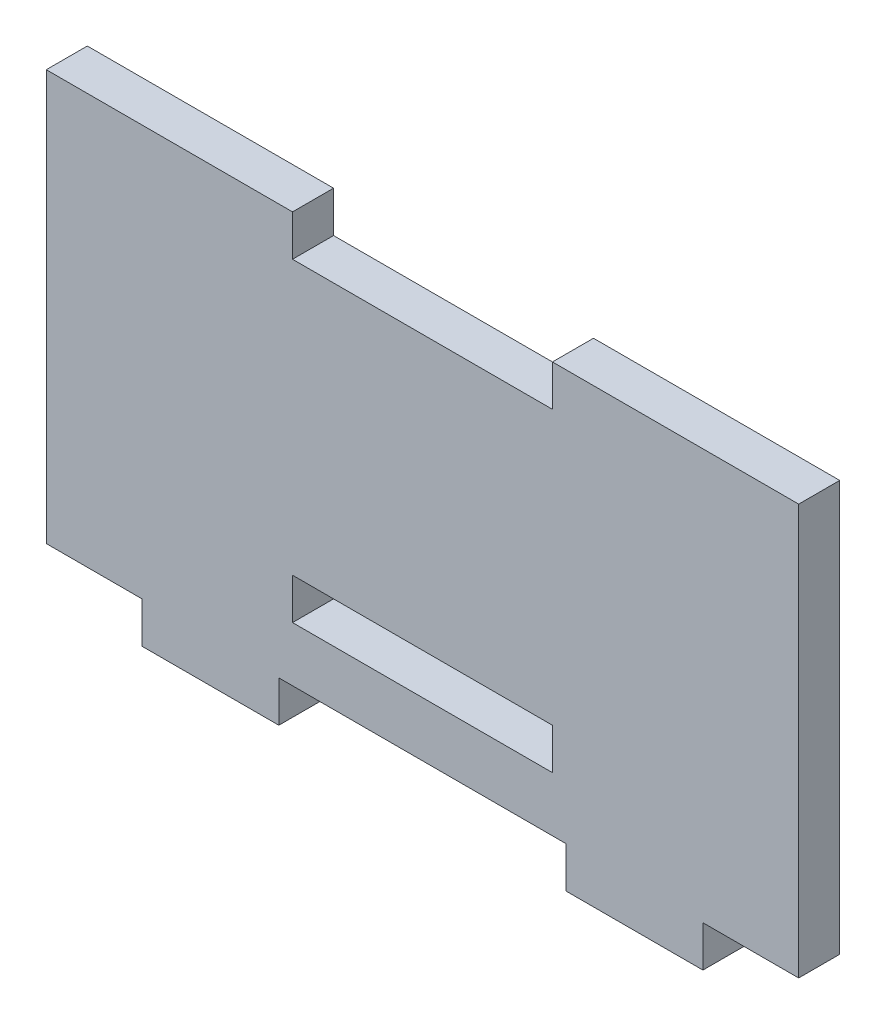
ISO-10303-21;
HEADER;
FILE_DESCRIPTION(('STEP AP214'),'2;1');
FILE_NAME('part.step','',(''),(''),'','','');
FILE_SCHEMA(('AUTOMOTIVE_DESIGN { 1 0 10303 214 1 1 1 1 }'));
ENDSEC;
DATA;
#1=APPLICATION_CONTEXT('core data for automotive mechanical design processes');
#2=APPLICATION_PROTOCOL_DEFINITION('international standard','automotive_design',2000,#1);
#3=PRODUCT_CONTEXT('',#1,'mechanical');
#4=PRODUCT('Part','Part','',(#3));
#5=PRODUCT_RELATED_PRODUCT_CATEGORY('part','',(#4));
#6=PRODUCT_DEFINITION_FORMATION('','',#4);
#7=PRODUCT_DEFINITION_CONTEXT('part definition',#1,'design');
#8=PRODUCT_DEFINITION('design','',#6,#7);
#9=PRODUCT_DEFINITION_SHAPE('','',#8);
#10=(LENGTH_UNIT() NAMED_UNIT(*) SI_UNIT(.MILLI.,.METRE.));
#11=(NAMED_UNIT(*) PLANE_ANGLE_UNIT() SI_UNIT($,.RADIAN.));
#12=(NAMED_UNIT(*) SI_UNIT($,.STERADIAN.) SOLID_ANGLE_UNIT());
#13=UNCERTAINTY_MEASURE_WITH_UNIT(LENGTH_MEASURE(1.E-05),#10,'distance_accuracy_value','');
#14=(GEOMETRIC_REPRESENTATION_CONTEXT(3) GLOBAL_UNCERTAINTY_ASSIGNED_CONTEXT((#13)) GLOBAL_UNIT_ASSIGNED_CONTEXT((#10,
#11,#12)) REPRESENTATION_CONTEXT('',''));
#15=CARTESIAN_POINT('',(0.,0.,0.));
#16=DIRECTION('',(0.,0.,1.));
#17=DIRECTION('',(1.,0.,0.));
#18=AXIS2_PLACEMENT_3D('',#15,#16,#17);
#19=CARTESIAN_POINT('',(0.,0.,3.));
#20=DIRECTION('',(0.,1.,0.));
#21=DIRECTION('',(0.,0.,1.));
#22=AXIS2_PLACEMENT_3D('',#19,#20,#21);
#23=PLANE('',#22);
#24=DIRECTION('',(1.,0.,0.));
#25=VECTOR('',#24,1.);
#26=CARTESIAN_POINT('',(0.,0.,0.));
#27=LINE('',#26,#25);
#28=CARTESIAN_POINT('',(17.,0.,0.));
#29=VERTEX_POINT('',#28);
#30=CARTESIAN_POINT('',(38.,0.,0.));
#31=VERTEX_POINT('',#30);
#32=EDGE_CURVE('E217',#29,#31,#27,.T.);
#33=ORIENTED_EDGE('',*,*,#32,.T.);
#34=DIRECTION('',(0.,0.,-1.));
#35=VECTOR('',#34,1.);
#36=CARTESIAN_POINT('',(38.,0.,3.));
#37=LINE('',#36,#35);
#38=CARTESIAN_POINT('',(38.,0.,3.));
#39=VERTEX_POINT('',#38);
#40=EDGE_CURVE('E11',#39,#31,#37,.T.);
#41=ORIENTED_EDGE('',*,*,#40,.F.);
#42=DIRECTION('',(1.,0.,0.));
#43=VECTOR('',#42,1.);
#44=CARTESIAN_POINT('',(0.,0.,3.));
#45=LINE('',#44,#43);
#46=CARTESIAN_POINT('',(17.,0.,3.));
#47=VERTEX_POINT('',#46);
#48=EDGE_CURVE('E309',#47,#39,#45,.T.);
#49=ORIENTED_EDGE('',*,*,#48,.F.);
#50=DIRECTION('',(0.,0.,-1.));
#51=VECTOR('',#50,1.);
#52=CARTESIAN_POINT('',(17.,0.,3.));
#53=LINE('',#52,#51);
#54=EDGE_CURVE('E259',#47,#29,#53,.T.);
#55=ORIENTED_EDGE('',*,*,#54,.T.);
#56=EDGE_LOOP('',(#33,#41,#49,#55));
#57=FACE_BOUND('',#56,.T.);
#58=ADVANCED_FACE('F35',(#57),#23,.F.);
#59=CARTESIAN_POINT('',(38.,0.,3.));
#60=DIRECTION('',(-1.,0.,0.));
#61=DIRECTION('',(0.,0.,1.));
#62=AXIS2_PLACEMENT_3D('',#59,#60,#61);
#63=PLANE('',#62);
#64=DIRECTION('',(0.,1.,0.));
#65=VECTOR('',#64,1.);
#66=CARTESIAN_POINT('',(38.,0.,0.));
#67=LINE('',#66,#65);
#68=CARTESIAN_POINT('',(38.,-3.,0.));
#69=VERTEX_POINT('',#68);
#70=EDGE_CURVE('E220',#69,#31,#67,.T.);
#71=ORIENTED_EDGE('',*,*,#70,.F.);
#72=DIRECTION('',(0.,0.,-1.));
#73=VECTOR('',#72,1.);
#74=CARTESIAN_POINT('',(38.,-3.,3.));
#75=LINE('',#74,#73);
#76=CARTESIAN_POINT('',(38.,-3.,3.));
#77=VERTEX_POINT('',#76);
#78=EDGE_CURVE('E45',#77,#69,#75,.T.);
#79=ORIENTED_EDGE('',*,*,#78,.F.);
#80=DIRECTION('',(0.,1.,0.));
#81=VECTOR('',#80,1.);
#82=CARTESIAN_POINT('',(38.,0.,3.));
#83=LINE('',#82,#81);
#84=EDGE_CURVE('E312',#77,#39,#83,.T.);
#85=ORIENTED_EDGE('',*,*,#84,.T.);
#86=ORIENTED_EDGE('',*,*,#40,.T.);
#87=EDGE_LOOP('',(#71,#79,#85,#86));
#88=FACE_BOUND('',#87,.T.);
#89=ADVANCED_FACE('F371',(#88),#63,.T.);
#90=CARTESIAN_POINT('',(0.,-2.99999999999999,3.));
#91=DIRECTION('',(0.,-1.,0.));
#92=DIRECTION('',(1.,0.,0.));
#93=AXIS2_PLACEMENT_3D('',#90,#91,#92);
#94=PLANE('',#93);
#95=DIRECTION('',(-1.,0.,0.));
#96=VECTOR('',#95,1.);
#97=CARTESIAN_POINT('',(0.,-2.99999999999999,0.));
#98=LINE('',#97,#96);
#99=CARTESIAN_POINT('',(48.,-3.,0.));
#100=VERTEX_POINT('',#99);
#101=EDGE_CURVE('E223',#100,#69,#98,.T.);
#102=ORIENTED_EDGE('',*,*,#101,.F.);
#103=DIRECTION('',(0.,0.,-1.));
#104=VECTOR('',#103,1.);
#105=CARTESIAN_POINT('',(48.,-3.,3.));
#106=LINE('',#105,#104);
#107=CARTESIAN_POINT('',(48.,-3.,3.));
#108=VERTEX_POINT('',#107);
#109=EDGE_CURVE('E281',#108,#100,#106,.T.);
#110=ORIENTED_EDGE('',*,*,#109,.F.);
#111=DIRECTION('',(-1.,0.,0.));
#112=VECTOR('',#111,1.);
#113=CARTESIAN_POINT('',(0.,-2.99999999999999,3.));
#114=LINE('',#113,#112);
#115=EDGE_CURVE('E319',#108,#77,#114,.T.);
#116=ORIENTED_EDGE('',*,*,#115,.T.);
#117=ORIENTED_EDGE('',*,*,#78,.T.);
#118=EDGE_LOOP('',(#102,#110,#116,#117));
#119=FACE_BOUND('',#118,.T.);
#120=ADVANCED_FACE('F377',(#119),#94,.T.);
#121=CARTESIAN_POINT('',(48.,0.,3.));
#122=DIRECTION('',(1.,0.,0.));
#123=DIRECTION('',(0.,0.,-1.));
#124=AXIS2_PLACEMENT_3D('',#121,#122,#123);
#125=PLANE('',#124);
#126=DIRECTION('',(0.,-1.,0.));
#127=VECTOR('',#126,1.);
#128=CARTESIAN_POINT('',(48.,0.,0.));
#129=LINE('',#128,#127);
#130=CARTESIAN_POINT('',(48.,0.,0.));
#131=VERTEX_POINT('',#130);
#132=EDGE_CURVE('E226',#131,#100,#129,.T.);
#133=ORIENTED_EDGE('',*,*,#132,.F.);
#134=DIRECTION('',(0.,0.,-1.));
#135=VECTOR('',#134,1.);
#136=CARTESIAN_POINT('',(48.,0.,3.));
#137=LINE('',#136,#135);
#138=CARTESIAN_POINT('',(48.,0.,3.));
#139=VERTEX_POINT('',#138);
#140=EDGE_CURVE('E279',#139,#131,#137,.T.);
#141=ORIENTED_EDGE('',*,*,#140,.F.);
#142=DIRECTION('',(0.,-1.,0.));
#143=VECTOR('',#142,1.);
#144=CARTESIAN_POINT('',(48.,0.,3.));
#145=LINE('',#144,#143);
#146=EDGE_CURVE('E322',#139,#108,#145,.T.);
#147=ORIENTED_EDGE('',*,*,#146,.T.);
#148=ORIENTED_EDGE('',*,*,#109,.T.);
#149=EDGE_LOOP('',(#133,#141,#147,#148));
#150=FACE_BOUND('',#149,.T.);
#151=ADVANCED_FACE('F516',(#150),#125,.T.);
#152=CARTESIAN_POINT('',(0.,-1.42742960308949E-13,3.));
#153=DIRECTION('',(0.,-1.,0.));
#154=DIRECTION('',(1.,0.,0.));
#155=AXIS2_PLACEMENT_3D('',#152,#153,#154);
#156=PLANE('',#155);
#157=DIRECTION('',(-1.,0.,0.));
#158=VECTOR('',#157,1.);
#159=CARTESIAN_POINT('',(0.,-1.42742960308949E-13,0.));
#160=LINE('',#159,#158);
#161=CARTESIAN_POINT('',(55.,0.,0.));
#162=VERTEX_POINT('',#161);
#163=EDGE_CURVE('E229',#162,#131,#160,.T.);
#164=ORIENTED_EDGE('',*,*,#163,.F.);
#165=DIRECTION('',(0.,0.,-1.));
#166=VECTOR('',#165,1.);
#167=CARTESIAN_POINT('',(55.,0.,3.));
#168=LINE('',#167,#166);
#169=CARTESIAN_POINT('',(55.,0.,3.));
#170=VERTEX_POINT('',#169);
#171=EDGE_CURVE('E277',#170,#162,#168,.T.);
#172=ORIENTED_EDGE('',*,*,#171,.F.);
#173=DIRECTION('',(-1.,0.,0.));
#174=VECTOR('',#173,1.);
#175=CARTESIAN_POINT('',(0.,-1.42742960308949E-13,3.));
#176=LINE('',#175,#174);
#177=EDGE_CURVE('E325',#170,#139,#176,.T.);
#178=ORIENTED_EDGE('',*,*,#177,.T.);
#179=ORIENTED_EDGE('',*,*,#140,.T.);
#180=EDGE_LOOP('',(#164,#172,#178,#179));
#181=FACE_BOUND('',#180,.T.);
#182=ADVANCED_FACE('F507',(#181),#156,.T.);
#183=CARTESIAN_POINT('',(55.,0.,3.));
#184=DIRECTION('',(1.,0.,0.));
#185=DIRECTION('',(0.,1.,0.));
#186=AXIS2_PLACEMENT_3D('',#183,#184,#185);
#187=PLANE('',#186);
#188=DIRECTION('',(0.,-1.,0.));
#189=VECTOR('',#188,1.);
#190=CARTESIAN_POINT('',(55.,0.,0.));
#191=LINE('',#190,#189);
#192=CARTESIAN_POINT('',(55.,30.,0.));
#193=VERTEX_POINT('',#192);
#194=EDGE_CURVE('E232',#193,#162,#191,.T.);
#195=ORIENTED_EDGE('',*,*,#194,.F.);
#196=DIRECTION('',(0.,0.,-1.));
#197=VECTOR('',#196,1.);
#198=CARTESIAN_POINT('',(55.,30.,3.));
#199=LINE('',#198,#197);
#200=CARTESIAN_POINT('',(55.,30.,3.));
#201=VERTEX_POINT('',#200);
#202=EDGE_CURVE('E275',#201,#193,#199,.T.);
#203=ORIENTED_EDGE('',*,*,#202,.F.);
#204=DIRECTION('',(0.,-1.,0.));
#205=VECTOR('',#204,1.);
#206=CARTESIAN_POINT('',(55.,0.,3.));
#207=LINE('',#206,#205);
#208=EDGE_CURVE('E328',#201,#170,#207,.T.);
#209=ORIENTED_EDGE('',*,*,#208,.T.);
#210=ORIENTED_EDGE('',*,*,#171,.T.);
#211=EDGE_LOOP('',(#195,#203,#209,#210));
#212=FACE_BOUND('',#211,.T.);
#213=ADVANCED_FACE('F498',(#212),#187,.T.);
#214=CARTESIAN_POINT('',(0.,30.,3.));
#215=DIRECTION('',(0.,1.,0.));
#216=DIRECTION('',(-1.,0.,0.));
#217=AXIS2_PLACEMENT_3D('',#214,#215,#216);
#218=PLANE('',#217);
#219=DIRECTION('',(1.,0.,0.));
#220=VECTOR('',#219,1.);
#221=CARTESIAN_POINT('',(0.,30.,0.));
#222=LINE('',#221,#220);
#223=CARTESIAN_POINT('',(37.,30.,0.));
#224=VERTEX_POINT('',#223);
#225=EDGE_CURVE('E235',#224,#193,#222,.T.);
#226=ORIENTED_EDGE('',*,*,#225,.F.);
#227=DIRECTION('',(0.,0.,-1.));
#228=VECTOR('',#227,1.);
#229=CARTESIAN_POINT('',(37.,30.,3.));
#230=LINE('',#229,#228);
#231=CARTESIAN_POINT('',(37.,30.,3.));
#232=VERTEX_POINT('',#231);
#233=EDGE_CURVE('E273',#232,#224,#230,.T.);
#234=ORIENTED_EDGE('',*,*,#233,.F.);
#235=DIRECTION('',(1.,0.,0.));
#236=VECTOR('',#235,1.);
#237=CARTESIAN_POINT('',(0.,30.,3.));
#238=LINE('',#237,#236);
#239=EDGE_CURVE('E331',#232,#201,#238,.T.);
#240=ORIENTED_EDGE('',*,*,#239,.T.);
#241=ORIENTED_EDGE('',*,*,#202,.T.);
#242=EDGE_LOOP('',(#226,#234,#240,#241));
#243=FACE_BOUND('',#242,.T.);
#244=ADVANCED_FACE('F489',(#243),#218,.T.);
#245=CARTESIAN_POINT('',(37.0000000000001,0.,3.));
#246=DIRECTION('',(-1.,0.,0.));
#247=DIRECTION('',(0.,-1.,0.));
#248=AXIS2_PLACEMENT_3D('',#245,#246,#247);
#249=PLANE('',#248);
#250=DIRECTION('',(0.,1.,0.));
#251=VECTOR('',#250,1.);
#252=CARTESIAN_POINT('',(37.0000000000001,0.,0.));
#253=LINE('',#252,#251);
#254=CARTESIAN_POINT('',(37.,27.,0.));
#255=VERTEX_POINT('',#254);
#256=EDGE_CURVE('E238',#255,#224,#253,.T.);
#257=ORIENTED_EDGE('',*,*,#256,.F.);
#258=DIRECTION('',(0.,0.,-1.));
#259=VECTOR('',#258,1.);
#260=CARTESIAN_POINT('',(37.,27.,3.));
#261=LINE('',#260,#259);
#262=CARTESIAN_POINT('',(37.,27.,3.));
#263=VERTEX_POINT('',#262);
#264=EDGE_CURVE('E271',#263,#255,#261,.T.);
#265=ORIENTED_EDGE('',*,*,#264,.F.);
#266=DIRECTION('',(0.,1.,0.));
#267=VECTOR('',#266,1.);
#268=CARTESIAN_POINT('',(37.0000000000001,0.,3.));
#269=LINE('',#268,#267);
#270=EDGE_CURVE('E334',#263,#232,#269,.T.);
#271=ORIENTED_EDGE('',*,*,#270,.T.);
#272=ORIENTED_EDGE('',*,*,#233,.T.);
#273=EDGE_LOOP('',(#257,#265,#271,#272));
#274=FACE_BOUND('',#273,.T.);
#275=ADVANCED_FACE('F480',(#274),#249,.T.);
#276=CARTESIAN_POINT('',(0.,27.,3.));
#277=DIRECTION('',(0.,1.,0.));
#278=DIRECTION('',(-1.,0.,0.));
#279=AXIS2_PLACEMENT_3D('',#276,#277,#278);
#280=PLANE('',#279);
#281=DIRECTION('',(1.,0.,0.));
#282=VECTOR('',#281,1.);
#283=CARTESIAN_POINT('',(0.,27.,0.));
#284=LINE('',#283,#282);
#285=CARTESIAN_POINT('',(18.,27.,0.));
#286=VERTEX_POINT('',#285);
#287=EDGE_CURVE('E241',#286,#255,#284,.T.);
#288=ORIENTED_EDGE('',*,*,#287,.F.);
#289=DIRECTION('',(0.,0.,-1.));
#290=VECTOR('',#289,1.);
#291=CARTESIAN_POINT('',(18.,27.,3.));
#292=LINE('',#291,#290);
#293=CARTESIAN_POINT('',(18.,27.,3.));
#294=VERTEX_POINT('',#293);
#295=EDGE_CURVE('E269',#294,#286,#292,.T.);
#296=ORIENTED_EDGE('',*,*,#295,.F.);
#297=DIRECTION('',(1.,0.,0.));
#298=VECTOR('',#297,1.);
#299=CARTESIAN_POINT('',(0.,27.,3.));
#300=LINE('',#299,#298);
#301=EDGE_CURVE('E337',#294,#263,#300,.T.);
#302=ORIENTED_EDGE('',*,*,#301,.T.);
#303=ORIENTED_EDGE('',*,*,#264,.T.);
#304=EDGE_LOOP('',(#288,#296,#302,#303));
#305=FACE_BOUND('',#304,.T.);
#306=ADVANCED_FACE('F471',(#305),#280,.T.);
#307=CARTESIAN_POINT('',(18.,0.,3.));
#308=DIRECTION('',(1.,0.,0.));
#309=DIRECTION('',(0.,0.,-1.));
#310=AXIS2_PLACEMENT_3D('',#307,#308,#309);
#311=PLANE('',#310);
#312=DIRECTION('',(0.,-1.,0.));
#313=VECTOR('',#312,1.);
#314=CARTESIAN_POINT('',(18.,0.,0.));
#315=LINE('',#314,#313);
#316=CARTESIAN_POINT('',(18.,30.,0.));
#317=VERTEX_POINT('',#316);
#318=EDGE_CURVE('E244',#317,#286,#315,.T.);
#319=ORIENTED_EDGE('',*,*,#318,.F.);
#320=DIRECTION('',(0.,0.,-1.));
#321=VECTOR('',#320,1.);
#322=CARTESIAN_POINT('',(18.,30.,3.));
#323=LINE('',#322,#321);
#324=CARTESIAN_POINT('',(18.,30.,3.));
#325=VERTEX_POINT('',#324);
#326=EDGE_CURVE('E267',#325,#317,#323,.T.);
#327=ORIENTED_EDGE('',*,*,#326,.F.);
#328=DIRECTION('',(0.,-1.,0.));
#329=VECTOR('',#328,1.);
#330=CARTESIAN_POINT('',(18.,0.,3.));
#331=LINE('',#330,#329);
#332=EDGE_CURVE('E340',#325,#294,#331,.T.);
#333=ORIENTED_EDGE('',*,*,#332,.T.);
#334=ORIENTED_EDGE('',*,*,#295,.T.);
#335=EDGE_LOOP('',(#319,#327,#333,#334));
#336=FACE_BOUND('',#335,.T.);
#337=ADVANCED_FACE('F463',(#336),#311,.T.);
#338=CARTESIAN_POINT('',(0.,30.,3.));
#339=DIRECTION('',(0.,1.,0.));
#340=DIRECTION('',(-1.,0.,0.));
#341=AXIS2_PLACEMENT_3D('',#338,#339,#340);
#342=PLANE('',#341);
#343=DIRECTION('',(1.,0.,0.));
#344=VECTOR('',#343,1.);
#345=CARTESIAN_POINT('',(0.,30.,0.));
#346=LINE('',#345,#344);
#347=CARTESIAN_POINT('',(0.,30.,0.));
#348=VERTEX_POINT('',#347);
#349=EDGE_CURVE('E247',#348,#317,#346,.T.);
#350=ORIENTED_EDGE('',*,*,#349,.F.);
#351=DIRECTION('',(0.,0.,-1.));
#352=VECTOR('',#351,1.);
#353=CARTESIAN_POINT('',(0.,30.,3.));
#354=LINE('',#353,#352);
#355=CARTESIAN_POINT('',(0.,30.,3.));
#356=VERTEX_POINT('',#355);
#357=EDGE_CURVE('E265',#356,#348,#354,.T.);
#358=ORIENTED_EDGE('',*,*,#357,.F.);
#359=DIRECTION('',(1.,0.,0.));
#360=VECTOR('',#359,1.);
#361=CARTESIAN_POINT('',(0.,30.,3.));
#362=LINE('',#361,#360);
#363=EDGE_CURVE('E343',#356,#325,#362,.T.);
#364=ORIENTED_EDGE('',*,*,#363,.T.);
#365=ORIENTED_EDGE('',*,*,#326,.T.);
#366=EDGE_LOOP('',(#350,#358,#364,#365));
#367=FACE_BOUND('',#366,.T.);
#368=ADVANCED_FACE('F356',(#367),#342,.T.);
#369=CARTESIAN_POINT('',(0.,0.,3.));
#370=DIRECTION('',(-1.,0.,0.));
#371=DIRECTION('',(0.,0.,1.));
#372=AXIS2_PLACEMENT_3D('',#369,#370,#371);
#373=PLANE('',#372);
#374=DIRECTION('',(0.,1.,0.));
#375=VECTOR('',#374,1.);
#376=CARTESIAN_POINT('',(0.,0.,0.));
#377=LINE('',#376,#375);
#378=CARTESIAN_POINT('',(0.,0.,0.));
#379=VERTEX_POINT('',#378);
#380=EDGE_CURVE('E250',#379,#348,#377,.T.);
#381=ORIENTED_EDGE('',*,*,#380,.F.);
#382=DIRECTION('',(0.,0.,-1.));
#383=VECTOR('',#382,1.);
#384=CARTESIAN_POINT('',(0.,0.,3.));
#385=LINE('',#384,#383);
#386=CARTESIAN_POINT('',(0.,0.,3.));
#387=VERTEX_POINT('',#386);
#388=EDGE_CURVE('E263',#387,#379,#385,.T.);
#389=ORIENTED_EDGE('',*,*,#388,.F.);
#390=DIRECTION('',(0.,1.,0.));
#391=VECTOR('',#390,1.);
#392=CARTESIAN_POINT('',(0.,0.,3.));
#393=LINE('',#392,#391);
#394=EDGE_CURVE('E346',#387,#356,#393,.T.);
#395=ORIENTED_EDGE('',*,*,#394,.T.);
#396=ORIENTED_EDGE('',*,*,#357,.T.);
#397=EDGE_LOOP('',(#381,#389,#395,#396));
#398=FACE_BOUND('',#397,.T.);
#399=ADVANCED_FACE('F350',(#398),#373,.T.);
#400=CARTESIAN_POINT('',(0.,0.,3.));
#401=DIRECTION('',(0.,1.,0.));
#402=DIRECTION('',(0.,0.,1.));
#403=AXIS2_PLACEMENT_3D('',#400,#401,#402);
#404=PLANE('',#403);
#405=DIRECTION('',(1.,0.,0.));
#406=VECTOR('',#405,1.);
#407=CARTESIAN_POINT('',(0.,0.,0.));
#408=LINE('',#407,#406);
#409=CARTESIAN_POINT('',(7.,0.,0.));
#410=VERTEX_POINT('',#409);
#411=EDGE_CURVE('E253',#379,#410,#408,.T.);
#412=ORIENTED_EDGE('',*,*,#411,.T.);
#413=DIRECTION('',(0.,0.,-1.));
#414=VECTOR('',#413,1.);
#415=CARTESIAN_POINT('',(7.,0.,3.));
#416=LINE('',#415,#414);
#417=CARTESIAN_POINT('',(7.,0.,3.));
#418=VERTEX_POINT('',#417);
#419=EDGE_CURVE('E197',#418,#410,#416,.T.);
#420=ORIENTED_EDGE('',*,*,#419,.F.);
#421=DIRECTION('',(1.,0.,0.));
#422=VECTOR('',#421,1.);
#423=CARTESIAN_POINT('',(0.,0.,3.));
#424=LINE('',#423,#422);
#425=EDGE_CURVE('E188',#387,#418,#424,.T.);
#426=ORIENTED_EDGE('',*,*,#425,.F.);
#427=ORIENTED_EDGE('',*,*,#388,.T.);
#428=EDGE_LOOP('',(#412,#420,#426,#427));
#429=FACE_BOUND('',#428,.T.);
#430=ADVANCED_FACE('F361',(#429),#404,.F.);
#431=CARTESIAN_POINT('',(7.,0.,3.));
#432=DIRECTION('',(1.,0.,0.));
#433=DIRECTION('',(0.,0.,-1.));
#434=AXIS2_PLACEMENT_3D('',#431,#432,#433);
#435=PLANE('',#434);
#436=DIRECTION('',(0.,-1.,0.));
#437=VECTOR('',#436,1.);
#438=CARTESIAN_POINT('',(7.,0.,0.));
#439=LINE('',#438,#437);
#440=CARTESIAN_POINT('',(7.,-3.,0.));
#441=VERTEX_POINT('',#440);
#442=EDGE_CURVE('E196',#410,#441,#439,.T.);
#443=ORIENTED_EDGE('',*,*,#442,.T.);
#444=DIRECTION('',(0.,0.,-1.));
#445=VECTOR('',#444,1.);
#446=CARTESIAN_POINT('',(7.,-3.,3.));
#447=LINE('',#446,#445);
#448=CARTESIAN_POINT('',(7.,-3.,3.));
#449=VERTEX_POINT('',#448);
#450=EDGE_CURVE('E193',#449,#441,#447,.T.);
#451=ORIENTED_EDGE('',*,*,#450,.F.);
#452=DIRECTION('',(0.,-1.,0.));
#453=VECTOR('',#452,1.);
#454=CARTESIAN_POINT('',(7.,0.,3.));
#455=LINE('',#454,#453);
#456=EDGE_CURVE('E181',#418,#449,#455,.T.);
#457=ORIENTED_EDGE('',*,*,#456,.F.);
#458=ORIENTED_EDGE('',*,*,#419,.T.);
#459=EDGE_LOOP('',(#443,#451,#457,#458));
#460=FACE_BOUND('',#459,.T.);
#461=ADVANCED_FACE('F194',(#460),#435,.F.);
#462=CARTESIAN_POINT('',(0.,-3.,3.));
#463=DIRECTION('',(0.,1.,0.));
#464=DIRECTION('',(0.,0.,1.));
#465=AXIS2_PLACEMENT_3D('',#462,#463,#464);
#466=PLANE('',#465);
#467=DIRECTION('',(1.,0.,0.));
#468=VECTOR('',#467,1.);
#469=CARTESIAN_POINT('',(0.,-3.,0.));
#470=LINE('',#469,#468);
#471=CARTESIAN_POINT('',(17.,-3.,0.));
#472=VERTEX_POINT('',#471);
#473=EDGE_CURVE('E118',#441,#472,#470,.T.);
#474=ORIENTED_EDGE('',*,*,#473,.T.);
#475=DIRECTION('',(0.,0.,-1.));
#476=VECTOR('',#475,1.);
#477=CARTESIAN_POINT('',(17.,-3.,3.));
#478=LINE('',#477,#476);
#479=CARTESIAN_POINT('',(17.,-3.,3.));
#480=VERTEX_POINT('',#479);
#481=EDGE_CURVE('E198',#480,#472,#478,.T.);
#482=ORIENTED_EDGE('',*,*,#481,.F.);
#483=DIRECTION('',(1.,0.,0.));
#484=VECTOR('',#483,1.);
#485=CARTESIAN_POINT('',(0.,-3.,3.));
#486=LINE('',#485,#484);
#487=EDGE_CURVE('E185',#449,#480,#486,.T.);
#488=ORIENTED_EDGE('',*,*,#487,.F.);
#489=ORIENTED_EDGE('',*,*,#450,.T.);
#490=EDGE_LOOP('',(#474,#482,#488,#489));
#491=FACE_BOUND('',#490,.T.);
#492=ADVANCED_FACE('F200',(#491),#466,.F.);
#493=CARTESIAN_POINT('',(18.,0.,3.));
#494=DIRECTION('',(1.,0.,0.));
#495=DIRECTION('',(0.,0.,-1.));
#496=AXIS2_PLACEMENT_3D('',#493,#494,#495);
#497=PLANE('',#496);
#498=DIRECTION('',(0.,-1.,0.));
#499=VECTOR('',#498,1.);
#500=CARTESIAN_POINT('',(18.,0.,0.));
#501=LINE('',#500,#499);
#502=CARTESIAN_POINT('',(18.,7.00000000000001,0.));
#503=VERTEX_POINT('',#502);
#504=CARTESIAN_POINT('',(18.,4.,0.));
#505=VERTEX_POINT('',#504);
#506=EDGE_CURVE('E206',#503,#505,#501,.T.);
#507=ORIENTED_EDGE('',*,*,#506,.F.);
#508=DIRECTION('',(0.,0.,-1.));
#509=VECTOR('',#508,1.);
#510=CARTESIAN_POINT('',(18.,7.00000000000001,3.));
#511=LINE('',#510,#509);
#512=CARTESIAN_POINT('',(18.,7.00000000000001,3.));
#513=VERTEX_POINT('',#512);
#514=EDGE_CURVE('E39',#513,#503,#511,.T.);
#515=ORIENTED_EDGE('',*,*,#514,.F.);
#516=DIRECTION('',(0.,-1.,0.));
#517=VECTOR('',#516,1.);
#518=CARTESIAN_POINT('',(18.,0.,3.));
#519=LINE('',#518,#517);
#520=CARTESIAN_POINT('',(18.,4.,3.));
#521=VERTEX_POINT('',#520);
#522=EDGE_CURVE('E258',#513,#521,#519,.T.);
#523=ORIENTED_EDGE('',*,*,#522,.T.);
#524=DIRECTION('',(0.,0.,-1.));
#525=VECTOR('',#524,1.);
#526=CARTESIAN_POINT('',(18.,4.,3.));
#527=LINE('',#526,#525);
#528=EDGE_CURVE('E202',#521,#505,#527,.T.);
#529=ORIENTED_EDGE('',*,*,#528,.T.);
#530=EDGE_LOOP('',(#507,#515,#523,#529));
#531=FACE_BOUND('',#530,.T.);
#532=ADVANCED_FACE('F37',(#531),#497,.T.);
#533=CARTESIAN_POINT('',(0.,7.00000000000001,3.));
#534=DIRECTION('',(0.,-1.,0.));
#535=DIRECTION('',(0.,0.,-1.));
#536=AXIS2_PLACEMENT_3D('',#533,#534,#535);
#537=PLANE('',#536);
#538=DIRECTION('',(-1.,0.,0.));
#539=VECTOR('',#538,1.);
#540=CARTESIAN_POINT('',(0.,7.00000000000001,0.));
#541=LINE('',#540,#539);
#542=CARTESIAN_POINT('',(37.,7.00000000000001,0.));
#543=VERTEX_POINT('',#542);
#544=EDGE_CURVE('E209',#543,#503,#541,.T.);
#545=ORIENTED_EDGE('',*,*,#544,.F.);
#546=DIRECTION('',(0.,0.,-1.));
#547=VECTOR('',#546,1.);
#548=CARTESIAN_POINT('',(37.,7.00000000000001,3.));
#549=LINE('',#548,#547);
#550=CARTESIAN_POINT('',(37.,7.00000000000001,3.));
#551=VERTEX_POINT('',#550);
#552=EDGE_CURVE('E287',#551,#543,#549,.T.);
#553=ORIENTED_EDGE('',*,*,#552,.F.);
#554=DIRECTION('',(-1.,0.,0.));
#555=VECTOR('',#554,1.);
#556=CARTESIAN_POINT('',(0.,7.00000000000001,3.));
#557=LINE('',#556,#555);
#558=EDGE_CURVE('E296',#551,#513,#557,.T.);
#559=ORIENTED_EDGE('',*,*,#558,.T.);
#560=ORIENTED_EDGE('',*,*,#514,.T.);
#561=EDGE_LOOP('',(#545,#553,#559,#560));
#562=FACE_BOUND('',#561,.T.);
#563=ADVANCED_FACE('F294',(#562),#537,.T.);
#564=CARTESIAN_POINT('',(37.,0.,3.));
#565=DIRECTION('',(1.,0.,0.));
#566=DIRECTION('',(0.,0.,-1.));
#567=AXIS2_PLACEMENT_3D('',#564,#565,#566);
#568=PLANE('',#567);
#569=DIRECTION('',(0.,-1.,0.));
#570=VECTOR('',#569,1.);
#571=CARTESIAN_POINT('',(37.,0.,0.));
#572=LINE('',#571,#570);
#573=CARTESIAN_POINT('',(37.,4.,0.));
#574=VERTEX_POINT('',#573);
#575=EDGE_CURVE('E212',#543,#574,#572,.T.);
#576=ORIENTED_EDGE('',*,*,#575,.T.);
#577=DIRECTION('',(0.,0.,-1.));
#578=VECTOR('',#577,1.);
#579=CARTESIAN_POINT('',(37.,4.,3.));
#580=LINE('',#579,#578);
#581=CARTESIAN_POINT('',(37.,4.,3.));
#582=VERTEX_POINT('',#581);
#583=EDGE_CURVE('E285',#582,#574,#580,.T.);
#584=ORIENTED_EDGE('',*,*,#583,.F.);
#585=DIRECTION('',(0.,-1.,0.));
#586=VECTOR('',#585,1.);
#587=CARTESIAN_POINT('',(37.,0.,3.));
#588=LINE('',#587,#586);
#589=EDGE_CURVE('E310',#551,#582,#588,.T.);
#590=ORIENTED_EDGE('',*,*,#589,.F.);
#591=ORIENTED_EDGE('',*,*,#552,.T.);
#592=EDGE_LOOP('',(#576,#584,#590,#591));
#593=FACE_BOUND('',#592,.T.);
#594=ADVANCED_FACE('F303',(#593),#568,.F.);
#595=CARTESIAN_POINT('',(0.,4.,3.));
#596=DIRECTION('',(0.,-1.,0.));
#597=DIRECTION('',(0.,0.,-1.));
#598=AXIS2_PLACEMENT_3D('',#595,#596,#597);
#599=PLANE('',#598);
#600=DIRECTION('',(-1.,0.,0.));
#601=VECTOR('',#600,1.);
#602=CARTESIAN_POINT('',(0.,4.,0.));
#603=LINE('',#602,#601);
#604=EDGE_CURVE('E214',#574,#505,#603,.T.);
#605=ORIENTED_EDGE('',*,*,#604,.T.);
#606=ORIENTED_EDGE('',*,*,#528,.F.);
#607=DIRECTION('',(-1.,0.,0.));
#608=VECTOR('',#607,1.);
#609=CARTESIAN_POINT('',(0.,4.,3.));
#610=LINE('',#609,#608);
#611=EDGE_CURVE('E307',#582,#521,#610,.T.);
#612=ORIENTED_EDGE('',*,*,#611,.F.);
#613=ORIENTED_EDGE('',*,*,#583,.T.);
#614=EDGE_LOOP('',(#605,#606,#612,#613));
#615=FACE_BOUND('',#614,.T.);
#616=ADVANCED_FACE('F306',(#615),#599,.F.);
#617=CARTESIAN_POINT('',(17.,0.,3.));
#618=DIRECTION('',(-1.,0.,0.));
#619=DIRECTION('',(0.,0.,1.));
#620=AXIS2_PLACEMENT_3D('',#617,#618,#619);
#621=PLANE('',#620);
#622=DIRECTION('',(0.,1.,0.));
#623=VECTOR('',#622,1.);
#624=CARTESIAN_POINT('',(17.,0.,0.));
#625=LINE('',#624,#623);
#626=EDGE_CURVE('E124',#472,#29,#625,.T.);
#627=ORIENTED_EDGE('',*,*,#626,.T.);
#628=ORIENTED_EDGE('',*,*,#54,.F.);
#629=DIRECTION('',(0.,1.,0.));
#630=VECTOR('',#629,1.);
#631=CARTESIAN_POINT('',(17.,0.,3.));
#632=LINE('',#631,#630);
#633=EDGE_CURVE('E54',#480,#47,#632,.T.);
#634=ORIENTED_EDGE('',*,*,#633,.F.);
#635=ORIENTED_EDGE('',*,*,#481,.T.);
#636=EDGE_LOOP('',(#627,#628,#634,#635));
#637=FACE_BOUND('',#636,.T.);
#638=ADVANCED_FACE('F384',(#637),#621,.F.);
#639=CARTESIAN_POINT('',(0.,0.,3.));
#640=DIRECTION('',(0.,0.,1.));
#641=DIRECTION('',(1.,0.,0.));
#642=AXIS2_PLACEMENT_3D('',#639,#640,#641);
#643=PLANE('',#642);
#644=ORIENTED_EDGE('',*,*,#522,.F.);
#645=ORIENTED_EDGE('',*,*,#558,.F.);
#646=ORIENTED_EDGE('',*,*,#589,.T.);
#647=ORIENTED_EDGE('',*,*,#611,.T.);
#648=EDGE_LOOP('',(#644,#645,#646,#647));
#649=FACE_BOUND('',#648,.T.);
#650=ORIENTED_EDGE('',*,*,#48,.T.);
#651=ORIENTED_EDGE('',*,*,#84,.F.);
#652=ORIENTED_EDGE('',*,*,#115,.F.);
#653=ORIENTED_EDGE('',*,*,#146,.F.);
#654=ORIENTED_EDGE('',*,*,#177,.F.);
#655=ORIENTED_EDGE('',*,*,#208,.F.);
#656=ORIENTED_EDGE('',*,*,#239,.F.);
#657=ORIENTED_EDGE('',*,*,#270,.F.);
#658=ORIENTED_EDGE('',*,*,#301,.F.);
#659=ORIENTED_EDGE('',*,*,#332,.F.);
#660=ORIENTED_EDGE('',*,*,#363,.F.);
#661=ORIENTED_EDGE('',*,*,#394,.F.);
#662=ORIENTED_EDGE('',*,*,#425,.T.);
#663=ORIENTED_EDGE('',*,*,#456,.T.);
#664=ORIENTED_EDGE('',*,*,#487,.T.);
#665=ORIENTED_EDGE('',*,*,#633,.T.);
#666=EDGE_LOOP('',(#650,#651,#652,#653,#654,#655,#656,#657,#658,#659,#660,#661,#662,#663,#664,#665));
#667=FACE_BOUND('',#666,.T.);
#668=ADVANCED_FACE('F183',(#649,#667),#643,.T.);
#669=CARTESIAN_POINT('',(0.,0.,0.));
#670=DIRECTION('',(0.,0.,1.));
#671=DIRECTION('',(1.,0.,0.));
#672=AXIS2_PLACEMENT_3D('',#669,#670,#671);
#673=PLANE('',#672);
#674=ORIENTED_EDGE('',*,*,#506,.T.);
#675=ORIENTED_EDGE('',*,*,#604,.F.);
#676=ORIENTED_EDGE('',*,*,#575,.F.);
#677=ORIENTED_EDGE('',*,*,#544,.T.);
#678=EDGE_LOOP('',(#674,#675,#676,#677));
#679=FACE_BOUND('',#678,.T.);
#680=ORIENTED_EDGE('',*,*,#32,.F.);
#681=ORIENTED_EDGE('',*,*,#626,.F.);
#682=ORIENTED_EDGE('',*,*,#473,.F.);
#683=ORIENTED_EDGE('',*,*,#442,.F.);
#684=ORIENTED_EDGE('',*,*,#411,.F.);
#685=ORIENTED_EDGE('',*,*,#380,.T.);
#686=ORIENTED_EDGE('',*,*,#349,.T.);
#687=ORIENTED_EDGE('',*,*,#318,.T.);
#688=ORIENTED_EDGE('',*,*,#287,.T.);
#689=ORIENTED_EDGE('',*,*,#256,.T.);
#690=ORIENTED_EDGE('',*,*,#225,.T.);
#691=ORIENTED_EDGE('',*,*,#194,.T.);
#692=ORIENTED_EDGE('',*,*,#163,.T.);
#693=ORIENTED_EDGE('',*,*,#132,.T.);
#694=ORIENTED_EDGE('',*,*,#101,.T.);
#695=ORIENTED_EDGE('',*,*,#70,.T.);
#696=EDGE_LOOP('',(#680,#681,#682,#683,#684,#685,#686,#687,#688,#689,#690,#691,#692,#693,#694,#695));
#697=FACE_BOUND('',#696,.T.);
#698=ADVANCED_FACE('F300',(#679,#697),#673,.F.);
#699=CLOSED_SHELL('',(#58,#89,#120,#151,#182,#213,#244,#275,#306,#337,#368,#399,#430,#461,#492,
#532,#563,#594,#616,#638,#668,#698));
#700=MANIFOLD_SOLID_BREP('B2',#699);
#701=ADVANCED_BREP_SHAPE_REPRESENTATION('',(#18,#700),#14);
#702=SHAPE_DEFINITION_REPRESENTATION(#9,#701);
ENDSEC;
END-ISO-10303-21;
